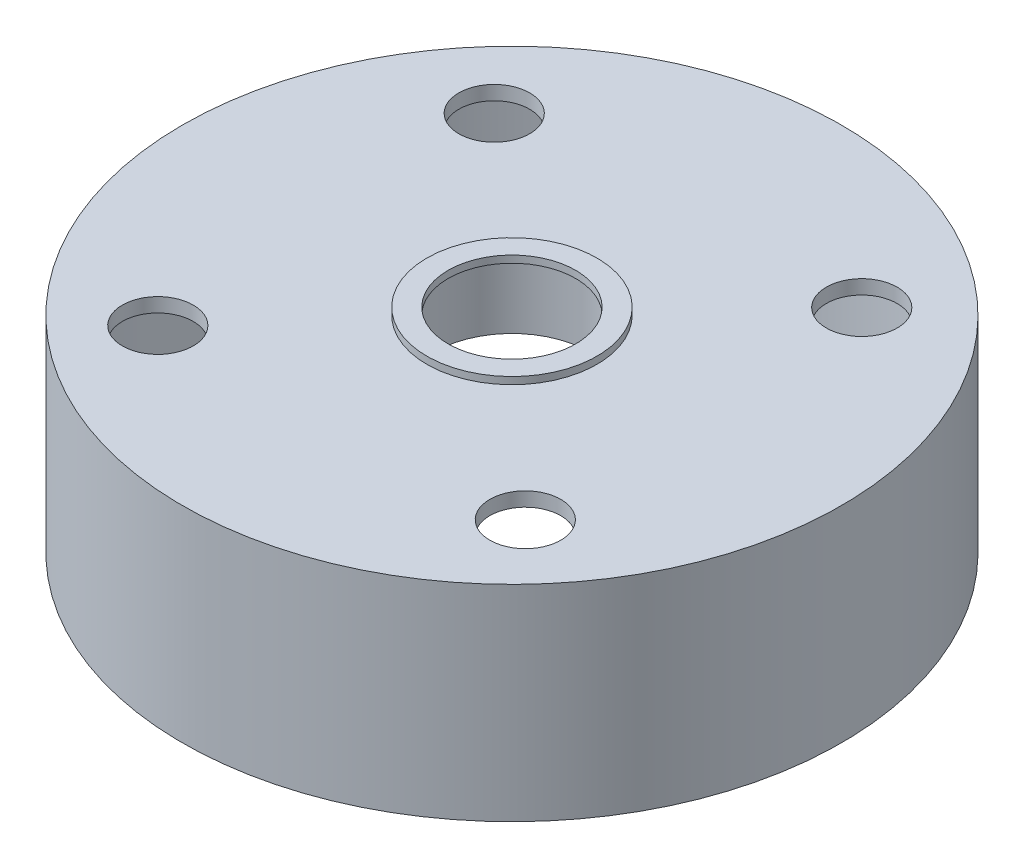
ISO-10303-21;
HEADER;
FILE_DESCRIPTION(('STEP AP214'),'2;1');
FILE_NAME('part.step','',(''),(''),'','','');
FILE_SCHEMA(('AUTOMOTIVE_DESIGN { 1 0 10303 214 1 1 1 1 }'));
ENDSEC;
DATA;
#1=APPLICATION_CONTEXT('core data for automotive mechanical design processes');
#2=APPLICATION_PROTOCOL_DEFINITION('international standard','automotive_design',2000,#1);
#3=PRODUCT_CONTEXT('',#1,'mechanical');
#4=PRODUCT('Part','Part','',(#3));
#5=PRODUCT_RELATED_PRODUCT_CATEGORY('part','',(#4));
#6=PRODUCT_DEFINITION_FORMATION('','',#4);
#7=PRODUCT_DEFINITION_CONTEXT('part definition',#1,'design');
#8=PRODUCT_DEFINITION('design','',#6,#7);
#9=PRODUCT_DEFINITION_SHAPE('','',#8);
#10=(LENGTH_UNIT() NAMED_UNIT(*) SI_UNIT(.MILLI.,.METRE.));
#11=(NAMED_UNIT(*) PLANE_ANGLE_UNIT() SI_UNIT($,.RADIAN.));
#12=(NAMED_UNIT(*) SI_UNIT($,.STERADIAN.) SOLID_ANGLE_UNIT());
#13=UNCERTAINTY_MEASURE_WITH_UNIT(LENGTH_MEASURE(1.E-05),#10,'distance_accuracy_value','');
#14=(GEOMETRIC_REPRESENTATION_CONTEXT(3) GLOBAL_UNCERTAINTY_ASSIGNED_CONTEXT((#13)) GLOBAL_UNIT_ASSIGNED_CONTEXT((#10,
#11,#12)) REPRESENTATION_CONTEXT('',''));
#15=CARTESIAN_POINT('',(0.,0.,0.));
#16=DIRECTION('',(0.,0.,1.));
#17=DIRECTION('',(1.,0.,0.));
#18=AXIS2_PLACEMENT_3D('',#15,#16,#17);
#19=CARTESIAN_POINT('',(-2.00812765930219E-05,122.269941963582,-0.304721770093616));
#20=DIRECTION('',(0.,1.,0.));
#21=DIRECTION('',(-1.,0.,0.));
#22=AXIS2_PLACEMENT_3D('',#19,#20,#21);
#23=CYLINDRICAL_SURFACE('',#22,15.);
#24=CARTESIAN_POINT('',(-2.00812765930219E-05,122.269941963582,-0.304721770093616));
#25=DIRECTION('',(0.,1.,0.));
#26=DIRECTION('',(-1.,0.,0.));
#27=AXIS2_PLACEMENT_3D('',#24,#25,#26);
#28=CIRCLE('',#27,15.);
#29=CARTESIAN_POINT('',(-15.0000200812766,122.269941963582,-0.304721770093616));
#30=VERTEX_POINT('',#29);
#31=EDGE_CURVE('E10',#30,#30,#28,.T.);
#32=ORIENTED_EDGE('',*,*,#31,.T.);
#33=EDGE_LOOP('',(#32));
#34=FACE_BOUND('',#33,.T.);
#35=CARTESIAN_POINT('',(-2.00812765939896E-05,130.269941963582,-0.304721770093616));
#36=DIRECTION('',(0.,1.,0.));
#37=DIRECTION('',(0.,0.,1.));
#38=AXIS2_PLACEMENT_3D('',#35,#36,#37);
#39=CIRCLE('',#38,15.);
#40=CARTESIAN_POINT('',(-2.00812765939896E-05,130.269941963582,14.6952782299064));
#41=VERTEX_POINT('',#40);
#42=EDGE_CURVE('E87',#41,#41,#39,.T.);
#43=ORIENTED_EDGE('',*,*,#42,.F.);
#44=EDGE_LOOP('',(#43));
#45=FACE_BOUND('',#44,.T.);
#46=ADVANCED_FACE('F32',(#34,#45),#23,.T.);
#47=CARTESIAN_POINT('',(-2.00812765930219E-05,122.269941963582,-0.304721770093616));
#48=DIRECTION('',(0.,1.,0.));
#49=DIRECTION('',(-1.,0.,0.));
#50=AXIS2_PLACEMENT_3D('',#47,#48,#49);
#51=PLANE('',#50);
#52=CARTESIAN_POINT('',(-2.00812765930219E-05,122.269941963582,-0.304721770093616));
#53=DIRECTION('',(0.,1.,0.));
#54=DIRECTION('',(-1.,0.,0.));
#55=AXIS2_PLACEMENT_3D('',#52,#53,#54);
#56=CIRCLE('',#55,11.);
#57=CARTESIAN_POINT('',(-11.0000200812766,122.269941963582,-0.304721770093616));
#58=VERTEX_POINT('',#57);
#59=EDGE_CURVE('E39',#58,#58,#56,.T.);
#60=ORIENTED_EDGE('',*,*,#59,.T.);
#61=EDGE_LOOP('',(#60));
#62=FACE_BOUND('',#61,.T.);
#63=ORIENTED_EDGE('',*,*,#31,.F.);
#64=EDGE_LOOP('',(#63));
#65=FACE_BOUND('',#64,.T.);
#66=ADVANCED_FACE('F113',(#62,#65),#51,.F.);
#67=CARTESIAN_POINT('',(-2.00812765942316E-05,132.269941963582,-0.304721770093616));
#68=DIRECTION('',(0.,1.,0.));
#69=DIRECTION('',(-1.,0.,0.));
#70=AXIS2_PLACEMENT_3D('',#67,#68,#69);
#71=PLANE('',#70);
#72=CARTESIAN_POINT('',(-23.735401167784,132.269941963582,25.9263006914521));
#73=DIRECTION('',(0.,1.,0.));
#74=DIRECTION('',(-1.,0.,0.));
#75=AXIS2_PLACEMENT_3D('',#72,#73,#74);
#76=CIRCLE('',#75,5.);
#77=CARTESIAN_POINT('',(-28.735401167784,132.269941963582,25.9263006914521));
#78=VERTEX_POINT('',#77);
#79=EDGE_CURVE('E238',#78,#78,#76,.T.);
#80=ORIENTED_EDGE('',*,*,#79,.F.);
#81=EDGE_LOOP('',(#80));
#82=FACE_BOUND('',#81,.T.);
#83=CARTESIAN_POINT('',(25.9263006914534,132.269941963582,23.7354011677839));
#84=DIRECTION('',(0.,1.,0.));
#85=DIRECTION('',(-1.,0.,0.));
#86=AXIS2_PLACEMENT_3D('',#83,#84,#85);
#87=CIRCLE('',#86,5.00000000000126);
#88=CARTESIAN_POINT('',(20.9263006914522,132.269941963582,23.7354011677839));
#89=VERTEX_POINT('',#88);
#90=EDGE_CURVE('E239',#89,#89,#87,.T.);
#91=ORIENTED_EDGE('',*,*,#90,.F.);
#92=EDGE_LOOP('',(#91));
#93=FACE_BOUND('',#92,.T.);
#94=CARTESIAN_POINT('',(23.7354011677853,132.269941963582,-25.9263006914535));
#95=DIRECTION('',(0.,1.,0.));
#96=DIRECTION('',(-1.,0.,0.));
#97=AXIS2_PLACEMENT_3D('',#94,#95,#96);
#98=CIRCLE('',#97,5.00000000000079);
#99=CARTESIAN_POINT('',(18.7354011677845,132.269941963582,-25.9263006914535));
#100=VERTEX_POINT('',#99);
#101=EDGE_CURVE('E242',#100,#100,#98,.T.);
#102=ORIENTED_EDGE('',*,*,#101,.F.);
#103=EDGE_LOOP('',(#102));
#104=FACE_BOUND('',#103,.T.);
#105=CARTESIAN_POINT('',(-25.9263006914521,132.269941963582,-23.7354011677854));
#106=DIRECTION('',(0.,1.,0.));
#107=DIRECTION('',(-1.,0.,0.));
#108=AXIS2_PLACEMENT_3D('',#105,#106,#107);
#109=CIRCLE('',#108,4.99999999999932);
#110=CARTESIAN_POINT('',(-30.9263006914514,132.269941963582,-23.7354011677854));
#111=VERTEX_POINT('',#110);
#112=EDGE_CURVE('E52',#111,#111,#109,.T.);
#113=ORIENTED_EDGE('',*,*,#112,.F.);
#114=EDGE_LOOP('',(#113));
#115=FACE_BOUND('',#114,.T.);
#116=CARTESIAN_POINT('',(-2.00812765942316E-05,132.269941963582,-0.304721770093616));
#117=DIRECTION('',(0.,1.,0.));
#118=DIRECTION('',(-1.,0.,0.));
#119=AXIS2_PLACEMENT_3D('',#116,#117,#118);
#120=CIRCLE('',#119,12.);
#121=CARTESIAN_POINT('',(-12.0000200812766,132.269941963582,-0.304721770093616));
#122=VERTEX_POINT('',#121);
#123=EDGE_CURVE('E68',#122,#122,#120,.T.);
#124=ORIENTED_EDGE('',*,*,#123,.F.);
#125=EDGE_LOOP('',(#124));
#126=FACE_BOUND('',#125,.T.);
#127=CARTESIAN_POINT('',(-2.00812765942316E-05,132.269941963582,-0.304721770093616));
#128=DIRECTION('',(0.,1.,0.));
#129=DIRECTION('',(-1.,0.,0.));
#130=AXIS2_PLACEMENT_3D('',#127,#128,#129);
#131=CIRCLE('',#130,46.5);
#132=CARTESIAN_POINT('',(-46.5000200812766,132.269941963582,-0.304721770093616));
#133=VERTEX_POINT('',#132);
#134=EDGE_CURVE('E83',#133,#133,#131,.T.);
#135=ORIENTED_EDGE('',*,*,#134,.T.);
#136=EDGE_LOOP('',(#135));
#137=FACE_BOUND('',#136,.T.);
#138=ADVANCED_FACE('F108',(#82,#93,#104,#115,#126,#137),#71,.T.);
#139=CARTESIAN_POINT('',(-2.00812765930219E-05,122.269941963582,-0.304721770093616));
#140=DIRECTION('',(0.,1.,0.));
#141=DIRECTION('',(-1.,0.,0.));
#142=AXIS2_PLACEMENT_3D('',#139,#140,#141);
#143=CYLINDRICAL_SURFACE('',#142,11.);
#144=ORIENTED_EDGE('',*,*,#59,.F.);
#145=EDGE_LOOP('',(#144));
#146=FACE_BOUND('',#145,.T.);
#147=CARTESIAN_POINT('',(-2.00812765942316E-05,132.269941963582,-0.304721770093616));
#148=DIRECTION('',(0.,1.,0.));
#149=DIRECTION('',(-1.,0.,0.));
#150=AXIS2_PLACEMENT_3D('',#147,#148,#149);
#151=CIRCLE('',#150,11.);
#152=CARTESIAN_POINT('',(-11.0000200812766,132.269941963582,-0.304721770093616));
#153=VERTEX_POINT('',#152);
#154=EDGE_CURVE('E75',#153,#153,#151,.F.);
#155=ORIENTED_EDGE('',*,*,#154,.F.);
#156=EDGE_LOOP('',(#155));
#157=FACE_BOUND('',#156,.T.);
#158=ADVANCED_FACE('F98',(#146,#157),#143,.F.);
#159=CARTESIAN_POINT('',(0.,130.269941963582,0.));
#160=DIRECTION('',(0.,1.,0.));
#161=DIRECTION('',(0.,0.,1.));
#162=AXIS2_PLACEMENT_3D('',#159,#160,#161);
#163=PLANE('',#162);
#164=CARTESIAN_POINT('',(-23.735401167784,130.269941963582,25.9263006914521));
#165=DIRECTION('',(0.,1.,0.));
#166=DIRECTION('',(0.,0.,1.));
#167=AXIS2_PLACEMENT_3D('',#164,#165,#166);
#168=CIRCLE('',#167,5.);
#169=CARTESIAN_POINT('',(-23.735401167784,130.269941963582,30.9263006914521));
#170=VERTEX_POINT('',#169);
#171=EDGE_CURVE('E35',#170,#170,#168,.T.);
#172=ORIENTED_EDGE('',*,*,#171,.T.);
#173=EDGE_LOOP('',(#172));
#174=FACE_BOUND('',#173,.T.);
#175=CARTESIAN_POINT('',(25.9263006914534,130.269941963582,23.7354011677839));
#176=DIRECTION('',(0.,1.,0.));
#177=DIRECTION('',(0.,0.,1.));
#178=AXIS2_PLACEMENT_3D('',#175,#176,#177);
#179=CIRCLE('',#178,5.00000000000126);
#180=CARTESIAN_POINT('',(25.9263006914534,130.269941963582,28.7354011677852));
#181=VERTEX_POINT('',#180);
#182=EDGE_CURVE('E54',#181,#181,#179,.T.);
#183=ORIENTED_EDGE('',*,*,#182,.T.);
#184=EDGE_LOOP('',(#183));
#185=FACE_BOUND('',#184,.T.);
#186=CARTESIAN_POINT('',(23.7354011677853,130.269941963582,-25.9263006914535));
#187=DIRECTION('',(0.,1.,0.));
#188=DIRECTION('',(0.,0.,1.));
#189=AXIS2_PLACEMENT_3D('',#186,#187,#188);
#190=CIRCLE('',#189,5.00000000000079);
#191=CARTESIAN_POINT('',(23.7354011677853,130.269941963582,-20.9263006914527));
#192=VERTEX_POINT('',#191);
#193=EDGE_CURVE('E51',#192,#192,#190,.T.);
#194=ORIENTED_EDGE('',*,*,#193,.T.);
#195=EDGE_LOOP('',(#194));
#196=FACE_BOUND('',#195,.T.);
#197=CARTESIAN_POINT('',(-25.9263006914521,130.269941963582,-23.7354011677854));
#198=DIRECTION('',(0.,1.,0.));
#199=DIRECTION('',(0.,0.,1.));
#200=AXIS2_PLACEMENT_3D('',#197,#198,#199);
#201=CIRCLE('',#200,4.99999999999932);
#202=CARTESIAN_POINT('',(-25.9263006914521,130.269941963582,-18.7354011677861));
#203=VERTEX_POINT('',#202);
#204=EDGE_CURVE('E48',#203,#203,#201,.T.);
#205=ORIENTED_EDGE('',*,*,#204,.T.);
#206=EDGE_LOOP('',(#205));
#207=FACE_BOUND('',#206,.T.);
#208=ORIENTED_EDGE('',*,*,#42,.T.);
#209=EDGE_LOOP('',(#208));
#210=FACE_BOUND('',#209,.T.);
#211=CARTESIAN_POINT('',(-2.00812765939896E-05,130.269941963582,-0.304721770093616));
#212=DIRECTION('',(0.,1.,0.));
#213=DIRECTION('',(0.,0.,1.));
#214=AXIS2_PLACEMENT_3D('',#211,#212,#213);
#215=CIRCLE('',#214,44.5);
#216=CARTESIAN_POINT('',(-2.00812765939896E-05,130.269941963582,44.1952782299064));
#217=VERTEX_POINT('',#216);
#218=EDGE_CURVE('E44',#217,#217,#215,.T.);
#219=ORIENTED_EDGE('',*,*,#218,.F.);
#220=EDGE_LOOP('',(#219));
#221=FACE_BOUND('',#220,.T.);
#222=ADVANCED_FACE('F96',(#174,#185,#196,#207,#210,#221),#163,.F.);
#223=CARTESIAN_POINT('',(-2.00812765907234E-05,103.269941963582,-0.304721770093617));
#224=DIRECTION('',(0.,1.,0.));
#225=DIRECTION('',(-1.,0.,0.));
#226=AXIS2_PLACEMENT_3D('',#223,#224,#225);
#227=CYLINDRICAL_SURFACE('',#226,44.5);
#228=CARTESIAN_POINT('',(-2.00812765907234E-05,103.269941963582,-0.304721770093617));
#229=DIRECTION('',(0.,1.,0.));
#230=DIRECTION('',(-1.,0.,0.));
#231=AXIS2_PLACEMENT_3D('',#228,#229,#230);
#232=CIRCLE('',#231,44.5);
#233=CARTESIAN_POINT('',(-44.5000200812766,103.269941963582,-0.304721770093617));
#234=VERTEX_POINT('',#233);
#235=EDGE_CURVE('E80',#234,#234,#232,.T.);
#236=ORIENTED_EDGE('',*,*,#235,.F.);
#237=EDGE_LOOP('',(#236));
#238=FACE_BOUND('',#237,.T.);
#239=ORIENTED_EDGE('',*,*,#218,.T.);
#240=EDGE_LOOP('',(#239));
#241=FACE_BOUND('',#240,.T.);
#242=ADVANCED_FACE('F94',(#238,#241),#227,.F.);
#243=CARTESIAN_POINT('',(-2.00812765907234E-05,103.269941963582,-0.304721770093617));
#244=DIRECTION('',(0.,1.,0.));
#245=DIRECTION('',(-1.,0.,0.));
#246=AXIS2_PLACEMENT_3D('',#243,#244,#245);
#247=CYLINDRICAL_SURFACE('',#246,46.5);
#248=CARTESIAN_POINT('',(-2.00812765907234E-05,103.269941963582,-0.304721770093617));
#249=DIRECTION('',(0.,1.,0.));
#250=DIRECTION('',(-1.,0.,0.));
#251=AXIS2_PLACEMENT_3D('',#248,#249,#250);
#252=CIRCLE('',#251,46.5);
#253=CARTESIAN_POINT('',(-46.5000200812766,103.269941963582,-0.304721770093617));
#254=VERTEX_POINT('',#253);
#255=EDGE_CURVE('E84',#254,#254,#252,.T.);
#256=ORIENTED_EDGE('',*,*,#255,.T.);
#257=EDGE_LOOP('',(#256));
#258=FACE_BOUND('',#257,.T.);
#259=ORIENTED_EDGE('',*,*,#134,.F.);
#260=EDGE_LOOP('',(#259));
#261=FACE_BOUND('',#260,.T.);
#262=ADVANCED_FACE('F105',(#258,#261),#247,.T.);
#263=CARTESIAN_POINT('',(-2.00812765907234E-05,103.269941963582,-0.304721770093617));
#264=DIRECTION('',(0.,1.,0.));
#265=DIRECTION('',(-1.,0.,0.));
#266=AXIS2_PLACEMENT_3D('',#263,#264,#265);
#267=PLANE('',#266);
#268=ORIENTED_EDGE('',*,*,#235,.T.);
#269=EDGE_LOOP('',(#268));
#270=FACE_BOUND('',#269,.T.);
#271=ORIENTED_EDGE('',*,*,#255,.F.);
#272=EDGE_LOOP('',(#271));
#273=FACE_BOUND('',#272,.T.);
#274=ADVANCED_FACE('F137',(#270,#273),#267,.F.);
#275=CARTESIAN_POINT('',(-2.00812765942316E-05,132.269941963582,-0.304721770093616));
#276=DIRECTION('',(0.,1.,0.));
#277=DIRECTION('',(-1.,0.,0.));
#278=AXIS2_PLACEMENT_3D('',#275,#276,#277);
#279=PLANE('',#278);
#280=CARTESIAN_POINT('',(-2.00812765942316E-05,132.269941963582,-0.304721770093616));
#281=DIRECTION('',(0.,1.,0.));
#282=DIRECTION('',(-1.,0.,0.));
#283=AXIS2_PLACEMENT_3D('',#280,#281,#282);
#284=CIRCLE('',#283,9.);
#285=CARTESIAN_POINT('',(-9.0000200812766,132.269941963582,-0.304721770093616));
#286=VERTEX_POINT('',#285);
#287=EDGE_CURVE('E59',#286,#286,#284,.T.);
#288=ORIENTED_EDGE('',*,*,#287,.T.);
#289=EDGE_LOOP('',(#288));
#290=FACE_BOUND('',#289,.T.);
#291=ORIENTED_EDGE('',*,*,#154,.T.);
#292=EDGE_LOOP('',(#291));
#293=FACE_BOUND('',#292,.T.);
#294=ADVANCED_FACE('F134',(#290,#293),#279,.F.);
#295=CARTESIAN_POINT('',(-2.00812765943526E-05,133.269941963582,-0.304721770093616));
#296=DIRECTION('',(0.,1.,0.));
#297=DIRECTION('',(-1.,0.,0.));
#298=AXIS2_PLACEMENT_3D('',#295,#296,#297);
#299=PLANE('',#298);
#300=CARTESIAN_POINT('',(-2.00812765943526E-05,133.269941963582,-0.304721770093616));
#301=DIRECTION('',(0.,1.,0.));
#302=DIRECTION('',(-1.,0.,0.));
#303=AXIS2_PLACEMENT_3D('',#300,#301,#302);
#304=CIRCLE('',#303,12.);
#305=CARTESIAN_POINT('',(-12.0000200812766,133.269941963582,-0.304721770093616));
#306=VERTEX_POINT('',#305);
#307=EDGE_CURVE('E72',#306,#306,#304,.T.);
#308=ORIENTED_EDGE('',*,*,#307,.T.);
#309=EDGE_LOOP('',(#308));
#310=FACE_BOUND('',#309,.T.);
#311=CARTESIAN_POINT('',(-2.00812765943526E-05,133.269941963582,-0.304721770093616));
#312=DIRECTION('',(0.,1.,0.));
#313=DIRECTION('',(-1.,0.,0.));
#314=AXIS2_PLACEMENT_3D('',#311,#312,#313);
#315=CIRCLE('',#314,9.);
#316=CARTESIAN_POINT('',(-9.0000200812766,133.269941963582,-0.304721770093616));
#317=VERTEX_POINT('',#316);
#318=EDGE_CURVE('E63',#317,#317,#315,.T.);
#319=ORIENTED_EDGE('',*,*,#318,.F.);
#320=EDGE_LOOP('',(#319));
#321=FACE_BOUND('',#320,.T.);
#322=ADVANCED_FACE('F136',(#310,#321),#299,.T.);
#323=CARTESIAN_POINT('',(-2.00812765943526E-05,133.269941963582,-0.304721770093616));
#324=DIRECTION('',(0.,-1.,0.));
#325=DIRECTION('',(1.,0.,0.));
#326=AXIS2_PLACEMENT_3D('',#323,#324,#325);
#327=CYLINDRICAL_SURFACE('',#326,12.);
#328=ORIENTED_EDGE('',*,*,#307,.F.);
#329=EDGE_LOOP('',(#328));
#330=FACE_BOUND('',#329,.T.);
#331=ORIENTED_EDGE('',*,*,#123,.T.);
#332=EDGE_LOOP('',(#331));
#333=FACE_BOUND('',#332,.T.);
#334=ADVANCED_FACE('F144',(#330,#333),#327,.T.);
#335=CARTESIAN_POINT('',(-2.00812765943526E-05,133.269941963582,-0.304721770093616));
#336=DIRECTION('',(0.,-1.,0.));
#337=DIRECTION('',(1.,0.,0.));
#338=AXIS2_PLACEMENT_3D('',#335,#336,#337);
#339=CYLINDRICAL_SURFACE('',#338,9.);
#340=ORIENTED_EDGE('',*,*,#318,.T.);
#341=EDGE_LOOP('',(#340));
#342=FACE_BOUND('',#341,.T.);
#343=ORIENTED_EDGE('',*,*,#287,.F.);
#344=EDGE_LOOP('',(#343));
#345=FACE_BOUND('',#344,.T.);
#346=ADVANCED_FACE('F152',(#342,#345),#339,.F.);
#347=CARTESIAN_POINT('',(-25.9263006914521,128.269941963582,-23.7354011677854));
#348=DIRECTION('',(0.,1.,0.));
#349=DIRECTION('',(-1.,0.,0.));
#350=AXIS2_PLACEMENT_3D('',#347,#348,#349);
#351=CYLINDRICAL_SURFACE('',#350,4.99999999999932);
#352=ORIENTED_EDGE('',*,*,#112,.T.);
#353=EDGE_LOOP('',(#352));
#354=FACE_BOUND('',#353,.T.);
#355=ORIENTED_EDGE('',*,*,#204,.F.);
#356=EDGE_LOOP('',(#355));
#357=FACE_BOUND('',#356,.T.);
#358=ADVANCED_FACE('F193',(#354,#357),#351,.F.);
#359=CARTESIAN_POINT('',(23.7354011677853,128.269941963582,-25.9263006914535));
#360=DIRECTION('',(0.,1.,0.));
#361=DIRECTION('',(-1.,0.,0.));
#362=AXIS2_PLACEMENT_3D('',#359,#360,#361);
#363=CYLINDRICAL_SURFACE('',#362,5.00000000000079);
#364=ORIENTED_EDGE('',*,*,#101,.T.);
#365=EDGE_LOOP('',(#364));
#366=FACE_BOUND('',#365,.T.);
#367=ORIENTED_EDGE('',*,*,#193,.F.);
#368=EDGE_LOOP('',(#367));
#369=FACE_BOUND('',#368,.T.);
#370=ADVANCED_FACE('F200',(#366,#369),#363,.F.);
#371=CARTESIAN_POINT('',(25.9263006914534,128.269941963582,23.7354011677839));
#372=DIRECTION('',(0.,1.,0.));
#373=DIRECTION('',(-1.,0.,0.));
#374=AXIS2_PLACEMENT_3D('',#371,#372,#373);
#375=CYLINDRICAL_SURFACE('',#374,5.00000000000126);
#376=ORIENTED_EDGE('',*,*,#90,.T.);
#377=EDGE_LOOP('',(#376));
#378=FACE_BOUND('',#377,.T.);
#379=ORIENTED_EDGE('',*,*,#182,.F.);
#380=EDGE_LOOP('',(#379));
#381=FACE_BOUND('',#380,.T.);
#382=ADVANCED_FACE('F209',(#378,#381),#375,.F.);
#383=CARTESIAN_POINT('',(-23.735401167784,128.269941963582,25.9263006914521));
#384=DIRECTION('',(0.,1.,0.));
#385=DIRECTION('',(-1.,0.,0.));
#386=AXIS2_PLACEMENT_3D('',#383,#384,#385);
#387=CYLINDRICAL_SURFACE('',#386,5.);
#388=ORIENTED_EDGE('',*,*,#79,.T.);
#389=EDGE_LOOP('',(#388));
#390=FACE_BOUND('',#389,.T.);
#391=ORIENTED_EDGE('',*,*,#171,.F.);
#392=EDGE_LOOP('',(#391));
#393=FACE_BOUND('',#392,.T.);
#394=ADVANCED_FACE('F218',(#390,#393),#387,.F.);
#395=CLOSED_SHELL('',(#46,#66,#138,#158,#222,#242,#262,#274,#294,#322,#334,#346,#358,#370,#382,#394));
#396=MANIFOLD_SOLID_BREP('B2',#395);
#397=ADVANCED_BREP_SHAPE_REPRESENTATION('',(#18,#396),#14);
#398=SHAPE_DEFINITION_REPRESENTATION(#9,#397);
ENDSEC;
END-ISO-10303-21;
